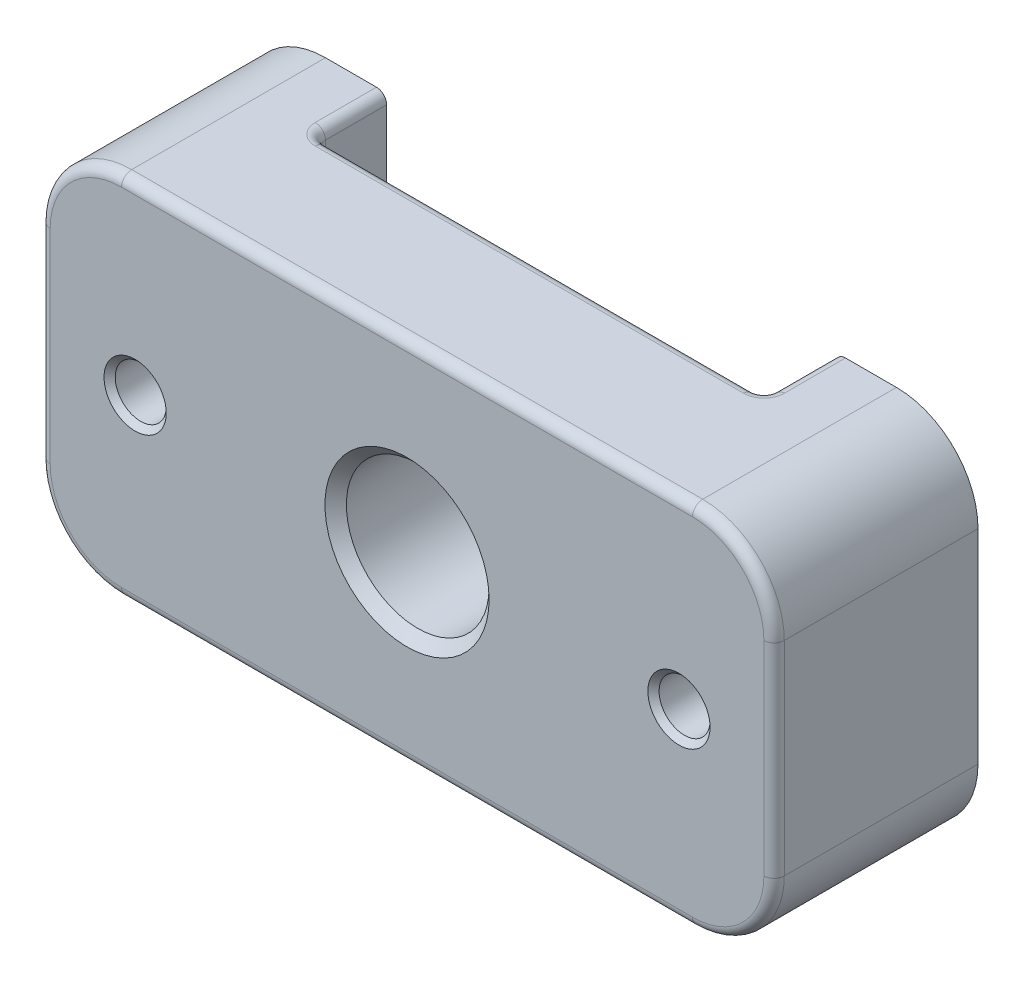
ISO-10303-21;
HEADER;
FILE_DESCRIPTION(('STEP AP214'),'2;1');
FILE_NAME('part.step','',(''),(''),'','','');
FILE_SCHEMA(('AUTOMOTIVE_DESIGN { 1 0 10303 214 1 1 1 1 }'));
ENDSEC;
DATA;
#1=APPLICATION_CONTEXT('core data for automotive mechanical design processes');
#2=APPLICATION_PROTOCOL_DEFINITION('international standard','automotive_design',2000,#1);
#3=PRODUCT_CONTEXT('',#1,'mechanical');
#4=PRODUCT('Part','Part','',(#3));
#5=PRODUCT_RELATED_PRODUCT_CATEGORY('part','',(#4));
#6=PRODUCT_DEFINITION_FORMATION('','',#4);
#7=PRODUCT_DEFINITION_CONTEXT('part definition',#1,'design');
#8=PRODUCT_DEFINITION('design','',#6,#7);
#9=PRODUCT_DEFINITION_SHAPE('','',#8);
#10=(LENGTH_UNIT() NAMED_UNIT(*) SI_UNIT(.MILLI.,.METRE.));
#11=(NAMED_UNIT(*) PLANE_ANGLE_UNIT() SI_UNIT($,.RADIAN.));
#12=(NAMED_UNIT(*) SI_UNIT($,.STERADIAN.) SOLID_ANGLE_UNIT());
#13=UNCERTAINTY_MEASURE_WITH_UNIT(LENGTH_MEASURE(1.E-05),#10,'distance_accuracy_value','');
#14=(GEOMETRIC_REPRESENTATION_CONTEXT(3) GLOBAL_UNCERTAINTY_ASSIGNED_CONTEXT((#13)) GLOBAL_UNIT_ASSIGNED_CONTEXT((#10,
#11,#12)) REPRESENTATION_CONTEXT('',''));
#15=CARTESIAN_POINT('',(0.,0.,0.));
#16=DIRECTION('',(0.,0.,1.));
#17=DIRECTION('',(1.,0.,0.));
#18=AXIS2_PLACEMENT_3D('',#15,#16,#17);
#19=CARTESIAN_POINT('',(14.,5.14174012529742,0.));
#20=DIRECTION('',(0.,0.,-1.));
#21=DIRECTION('',(-1.,0.,0.));
#22=AXIS2_PLACEMENT_3D('',#19,#20,#21);
#23=PLANE('',#22);
#24=DIRECTION('',(1.,0.,0.));
#25=VECTOR('',#24,1.);
#26=CARTESIAN_POINT('',(-14.,-8.85825987470258,0.));
#27=LINE('',#26,#25);
#28=CARTESIAN_POINT('',(11.5,-8.85825987470258,0.));
#29=VERTEX_POINT('',#28);
#30=CARTESIAN_POINT('',(14.,-8.85825987470258,0.));
#31=VERTEX_POINT('',#30);
#32=EDGE_CURVE('E275',#29,#31,#27,.T.);
#33=ORIENTED_EDGE('',*,*,#32,.F.);
#34=CARTESIAN_POINT('',(11.5,-8.35825987470258,0.));
#35=DIRECTION('',(0.,0.,-1.));
#36=DIRECTION('',(-1.,0.,0.));
#37=AXIS2_PLACEMENT_3D('',#34,#35,#36);
#38=CIRCLE('',#37,0.5);
#39=CARTESIAN_POINT('',(11.,-8.35825987470258,0.));
#40=VERTEX_POINT('',#39);
#41=EDGE_CURVE('E12',#29,#40,#38,.T.);
#42=ORIENTED_EDGE('',*,*,#41,.T.);
#43=DIRECTION('',(0.,-1.,0.));
#44=VECTOR('',#43,1.);
#45=CARTESIAN_POINT('',(11.,5.14174012529742,0.));
#46=LINE('',#45,#44);
#47=CARTESIAN_POINT('',(11.,8.64174012529742,0.));
#48=VERTEX_POINT('',#47);
#49=EDGE_CURVE('E310',#48,#40,#46,.T.);
#50=ORIENTED_EDGE('',*,*,#49,.F.);
#51=CARTESIAN_POINT('',(11.5,8.64174012529742,0.));
#52=DIRECTION('',(0.,0.,-1.));
#53=DIRECTION('',(-1.,0.,0.));
#54=AXIS2_PLACEMENT_3D('',#51,#52,#53);
#55=CIRCLE('',#54,0.5);
#56=CARTESIAN_POINT('',(11.5,9.14174012529742,0.));
#57=VERTEX_POINT('',#56);
#58=EDGE_CURVE('E69',#48,#57,#55,.T.);
#59=ORIENTED_EDGE('',*,*,#58,.T.);
#60=DIRECTION('',(-1.,0.,0.));
#61=VECTOR('',#60,1.);
#62=CARTESIAN_POINT('',(-14.,9.14174012529742,0.));
#63=LINE('',#62,#61);
#64=CARTESIAN_POINT('',(14.,9.14174012529742,0.));
#65=VERTEX_POINT('',#64);
#66=EDGE_CURVE('E224',#65,#57,#63,.T.);
#67=ORIENTED_EDGE('',*,*,#66,.F.);
#68=CARTESIAN_POINT('',(14.,5.14174012529742,0.));
#69=DIRECTION('',(0.,0.,1.));
#70=DIRECTION('',(-1.,0.,0.));
#71=AXIS2_PLACEMENT_3D('',#68,#69,#70);
#72=CIRCLE('',#71,4.);
#73=CARTESIAN_POINT('',(18.,5.14174012529742,0.));
#74=VERTEX_POINT('',#73);
#75=EDGE_CURVE('E240',#74,#65,#72,.T.);
#76=ORIENTED_EDGE('',*,*,#75,.F.);
#77=DIRECTION('',(0.,1.,0.));
#78=VECTOR('',#77,1.);
#79=CARTESIAN_POINT('',(18.,5.14174012529742,0.));
#80=LINE('',#79,#78);
#81=CARTESIAN_POINT('',(18.,-4.85825987470258,0.));
#82=VERTEX_POINT('',#81);
#83=EDGE_CURVE('E284',#82,#74,#80,.T.);
#84=ORIENTED_EDGE('',*,*,#83,.F.);
#85=CARTESIAN_POINT('',(14.,-4.85825987470258,0.));
#86=DIRECTION('',(0.,0.,1.));
#87=DIRECTION('',(1.,0.,0.));
#88=AXIS2_PLACEMENT_3D('',#85,#86,#87);
#89=CIRCLE('',#88,4.);
#90=EDGE_CURVE('E280',#31,#82,#89,.T.);
#91=ORIENTED_EDGE('',*,*,#90,.F.);
#92=EDGE_LOOP('',(#33,#42,#50,#59,#67,#76,#84,#91));
#93=FACE_BOUND('',#92,.T.);
#94=CARTESIAN_POINT('',(13.335,0.141740125297421,0.));
#95=DIRECTION('',(0.,0.,1.));
#96=DIRECTION('',(1.,0.,0.));
#97=AXIS2_PLACEMENT_3D('',#94,#95,#96);
#98=CIRCLE('',#97,1.25);
#99=CARTESIAN_POINT('',(14.585,0.141740125297421,0.));
#100=VERTEX_POINT('',#99);
#101=EDGE_CURVE('E261',#100,#100,#98,.T.);
#102=ORIENTED_EDGE('',*,*,#101,.T.);
#103=EDGE_LOOP('',(#102));
#104=FACE_BOUND('',#103,.T.);
#105=ADVANCED_FACE('F59',(#93,#104),#23,.T.);
#106=CARTESIAN_POINT('',(14.,5.14174012529742,10.));
#107=DIRECTION('',(0.,0.,-1.));
#108=DIRECTION('',(-1.,0.,0.));
#109=AXIS2_PLACEMENT_3D('',#106,#107,#108);
#110=PLANE('',#109);
#111=CARTESIAN_POINT('',(0.,0.141740125297421,10.));
#112=DIRECTION('',(0.,0.,1.));
#113=DIRECTION('',(1.,0.,0.));
#114=AXIS2_PLACEMENT_3D('',#111,#112,#113);
#115=CIRCLE('',#114,4.025);
#116=CARTESIAN_POINT('',(4.025,0.141740125297421,10.));
#117=VERTEX_POINT('',#116);
#118=EDGE_CURVE('E1012',#117,#117,#115,.T.);
#119=ORIENTED_EDGE('',*,*,#118,.F.);
#120=EDGE_LOOP('',(#119));
#121=FACE_BOUND('',#120,.T.);
#122=CARTESIAN_POINT('',(-13.335,0.141740125297421,10.));
#123=DIRECTION('',(0.,0.,1.));
#124=DIRECTION('',(1.,0.,0.));
#125=AXIS2_PLACEMENT_3D('',#122,#123,#124);
#126=CIRCLE('',#125,1.525);
#127=CARTESIAN_POINT('',(-11.81,0.141740125297421,10.));
#128=VERTEX_POINT('',#127);
#129=EDGE_CURVE('E660',#128,#128,#126,.T.);
#130=ORIENTED_EDGE('',*,*,#129,.F.);
#131=EDGE_LOOP('',(#130));
#132=FACE_BOUND('',#131,.T.);
#133=DIRECTION('',(0.,1.,0.));
#134=VECTOR('',#133,1.);
#135=CARTESIAN_POINT('',(17.5,5.14174012529742,10.));
#136=LINE('',#135,#134);
#137=CARTESIAN_POINT('',(17.5,-4.85825987470258,10.));
#138=VERTEX_POINT('',#137);
#139=CARTESIAN_POINT('',(17.5,5.14174012529742,10.));
#140=VERTEX_POINT('',#139);
#141=EDGE_CURVE('E332',#138,#140,#136,.T.);
#142=ORIENTED_EDGE('',*,*,#141,.T.);
#143=CARTESIAN_POINT('',(14.,5.14174012529742,10.));
#144=DIRECTION('',(0.,0.,-1.));
#145=DIRECTION('',(-1.,0.,0.));
#146=AXIS2_PLACEMENT_3D('',#143,#144,#145);
#147=CIRCLE('',#146,3.5);
#148=CARTESIAN_POINT('',(14.,8.64174012529742,10.));
#149=VERTEX_POINT('',#148);
#150=EDGE_CURVE('E335',#140,#149,#147,.F.);
#151=ORIENTED_EDGE('',*,*,#150,.T.);
#152=DIRECTION('',(-1.,0.,0.));
#153=VECTOR('',#152,1.);
#154=CARTESIAN_POINT('',(14.,8.64174012529742,10.));
#155=LINE('',#154,#153);
#156=CARTESIAN_POINT('',(-14.,8.64174012529742,10.));
#157=VERTEX_POINT('',#156);
#158=EDGE_CURVE('E314',#149,#157,#155,.T.);
#159=ORIENTED_EDGE('',*,*,#158,.T.);
#160=CARTESIAN_POINT('',(-14.,5.14174012529742,10.));
#161=DIRECTION('',(0.,0.,-1.));
#162=DIRECTION('',(-1.,0.,0.));
#163=AXIS2_PLACEMENT_3D('',#160,#161,#162);
#164=CIRCLE('',#163,3.5);
#165=CARTESIAN_POINT('',(-17.5,5.14174012529742,10.));
#166=VERTEX_POINT('',#165);
#167=EDGE_CURVE('E317',#157,#166,#164,.F.);
#168=ORIENTED_EDGE('',*,*,#167,.T.);
#169=DIRECTION('',(0.,-1.,0.));
#170=VECTOR('',#169,1.);
#171=CARTESIAN_POINT('',(-17.5,5.14174012529741,10.));
#172=LINE('',#171,#170);
#173=CARTESIAN_POINT('',(-17.5,-4.85825987470258,10.));
#174=VERTEX_POINT('',#173);
#175=EDGE_CURVE('E320',#166,#174,#172,.T.);
#176=ORIENTED_EDGE('',*,*,#175,.T.);
#177=CARTESIAN_POINT('',(-14.,-4.85825987470258,10.));
#178=DIRECTION('',(0.,0.,-1.));
#179=DIRECTION('',(-1.,0.,0.));
#180=AXIS2_PLACEMENT_3D('',#177,#178,#179);
#181=CIRCLE('',#180,3.5);
#182=CARTESIAN_POINT('',(-14.,-8.35825987470258,10.));
#183=VERTEX_POINT('',#182);
#184=EDGE_CURVE('E323',#174,#183,#181,.F.);
#185=ORIENTED_EDGE('',*,*,#184,.T.);
#186=DIRECTION('',(1.,0.,0.));
#187=VECTOR('',#186,1.);
#188=CARTESIAN_POINT('',(14.,-8.35825987470258,10.));
#189=LINE('',#188,#187);
#190=CARTESIAN_POINT('',(14.,-8.35825987470258,10.));
#191=VERTEX_POINT('',#190);
#192=EDGE_CURVE('E326',#183,#191,#189,.T.);
#193=ORIENTED_EDGE('',*,*,#192,.T.);
#194=CARTESIAN_POINT('',(14.,-4.85825987470258,10.));
#195=DIRECTION('',(0.,0.,-1.));
#196=DIRECTION('',(-1.,0.,0.));
#197=AXIS2_PLACEMENT_3D('',#194,#195,#196);
#198=CIRCLE('',#197,3.5);
#199=EDGE_CURVE('E329',#191,#138,#198,.F.);
#200=ORIENTED_EDGE('',*,*,#199,.T.);
#201=EDGE_LOOP('',(#142,#151,#159,#168,#176,#185,#193,#200));
#202=FACE_BOUND('',#201,.T.);
#203=CARTESIAN_POINT('',(13.335,0.141740125297421,10.));
#204=DIRECTION('',(0.,0.,1.));
#205=DIRECTION('',(1.,0.,0.));
#206=AXIS2_PLACEMENT_3D('',#203,#204,#205);
#207=CIRCLE('',#206,1.525);
#208=CARTESIAN_POINT('',(14.86,0.141740125297421,10.));
#209=VERTEX_POINT('',#208);
#210=EDGE_CURVE('E651',#209,#209,#207,.T.);
#211=ORIENTED_EDGE('',*,*,#210,.F.);
#212=EDGE_LOOP('',(#211));
#213=FACE_BOUND('',#212,.T.);
#214=ADVANCED_FACE('F533',(#121,#132,#202,#213),#110,.F.);
#215=CARTESIAN_POINT('',(14.,5.14174012529742,10.));
#216=DIRECTION('',(0.,0.,-1.));
#217=DIRECTION('',(-1.,0.,0.));
#218=AXIS2_PLACEMENT_3D('',#215,#216,#217);
#219=CYLINDRICAL_SURFACE('',#218,4.);
#220=DIRECTION('',(0.,0.,-1.));
#221=VECTOR('',#220,1.);
#222=CARTESIAN_POINT('',(14.,9.14174012529742,10.));
#223=LINE('',#222,#221);
#224=CARTESIAN_POINT('',(14.,9.14174012529742,9.5));
#225=VERTEX_POINT('',#224);
#226=EDGE_CURVE('E220',#225,#65,#223,.T.);
#227=ORIENTED_EDGE('',*,*,#226,.F.);
#228=CARTESIAN_POINT('',(14.,5.14174012529742,9.5));
#229=DIRECTION('',(0.,0.,-1.));
#230=DIRECTION('',(-1.,0.,0.));
#231=AXIS2_PLACEMENT_3D('',#228,#229,#230);
#232=CIRCLE('',#231,4.);
#233=CARTESIAN_POINT('',(18.,5.14174012529742,9.5));
#234=VERTEX_POINT('',#233);
#235=EDGE_CURVE('E339',#225,#234,#232,.T.);
#236=ORIENTED_EDGE('',*,*,#235,.T.);
#237=DIRECTION('',(0.,0.,-1.));
#238=VECTOR('',#237,1.);
#239=CARTESIAN_POINT('',(18.,5.14174012529742,10.));
#240=LINE('',#239,#238);
#241=EDGE_CURVE('E249',#234,#74,#240,.T.);
#242=ORIENTED_EDGE('',*,*,#241,.T.);
#243=ORIENTED_EDGE('',*,*,#75,.T.);
#244=EDGE_LOOP('',(#227,#236,#242,#243));
#245=FACE_BOUND('',#244,.T.);
#246=ADVANCED_FACE('F247',(#245),#219,.T.);
#247=CARTESIAN_POINT('',(-14.,9.14174012529742,10.));
#248=DIRECTION('',(0.,-1.,0.));
#249=DIRECTION('',(0.,0.,-1.));
#250=AXIS2_PLACEMENT_3D('',#247,#248,#249);
#251=PLANE('',#250);
#252=DIRECTION('',(0.,0.,-1.));
#253=VECTOR('',#252,1.);
#254=CARTESIAN_POINT('',(-14.,9.14174012529742,10.));
#255=LINE('',#254,#253);
#256=CARTESIAN_POINT('',(-14.,9.14174012529742,9.5));
#257=VERTEX_POINT('',#256);
#258=CARTESIAN_POINT('',(-14.,9.14174012529742,0.));
#259=VERTEX_POINT('',#258);
#260=EDGE_CURVE('E233',#257,#259,#255,.T.);
#261=ORIENTED_EDGE('',*,*,#260,.F.);
#262=DIRECTION('',(-1.,0.,0.));
#263=VECTOR('',#262,1.);
#264=CARTESIAN_POINT('',(-14.,9.14174012529742,9.5));
#265=LINE('',#264,#263);
#266=EDGE_CURVE('E226',#257,#225,#265,.F.);
#267=ORIENTED_EDGE('',*,*,#266,.T.);
#268=ORIENTED_EDGE('',*,*,#226,.T.);
#269=ORIENTED_EDGE('',*,*,#66,.T.);
#270=DIRECTION('',(0.,0.,-1.));
#271=VECTOR('',#270,1.);
#272=CARTESIAN_POINT('',(11.5,9.14174012529742,10.));
#273=LINE('',#272,#271);
#274=CARTESIAN_POINT('',(11.5,9.14174012529742,3.));
#275=VERTEX_POINT('',#274);
#276=EDGE_CURVE('E77',#57,#275,#273,.F.);
#277=ORIENTED_EDGE('',*,*,#276,.T.);
#278=CARTESIAN_POINT('',(10.5,9.14174012529742,3.));
#279=DIRECTION('',(0.,-1.,0.));
#280=DIRECTION('',(0.,0.,-1.));
#281=AXIS2_PLACEMENT_3D('',#278,#279,#280);
#282=CIRCLE('',#281,1.);
#283=CARTESIAN_POINT('',(10.5,9.14174012529742,4.));
#284=VERTEX_POINT('',#283);
#285=EDGE_CURVE('E82',#284,#275,#282,.F.);
#286=ORIENTED_EDGE('',*,*,#285,.F.);
#287=DIRECTION('',(1.,0.,0.));
#288=VECTOR('',#287,1.);
#289=CARTESIAN_POINT('',(-14.,9.14174012529742,4.));
#290=LINE('',#289,#288);
#291=CARTESIAN_POINT('',(-10.5,9.14174012529742,4.));
#292=VERTEX_POINT('',#291);
#293=EDGE_CURVE('E413',#284,#292,#290,.F.);
#294=ORIENTED_EDGE('',*,*,#293,.T.);
#295=CARTESIAN_POINT('',(-10.5,9.14174012529742,3.));
#296=DIRECTION('',(0.,-1.,0.));
#297=DIRECTION('',(0.,0.,-1.));
#298=AXIS2_PLACEMENT_3D('',#295,#296,#297);
#299=CIRCLE('',#298,1.);
#300=CARTESIAN_POINT('',(-11.5,9.14174012529742,3.));
#301=VERTEX_POINT('',#300);
#302=EDGE_CURVE('E409',#301,#292,#299,.F.);
#303=ORIENTED_EDGE('',*,*,#302,.F.);
#304=DIRECTION('',(0.,0.,1.));
#305=VECTOR('',#304,1.);
#306=CARTESIAN_POINT('',(-11.5,9.14174012529742,10.));
#307=LINE('',#306,#305);
#308=CARTESIAN_POINT('',(-11.5,9.14174012529742,0.));
#309=VERTEX_POINT('',#308);
#310=EDGE_CURVE('E406',#301,#309,#307,.F.);
#311=ORIENTED_EDGE('',*,*,#310,.T.);
#312=EDGE_CURVE('E245',#309,#259,#63,.T.);
#313=ORIENTED_EDGE('',*,*,#312,.T.);
#314=EDGE_LOOP('',(#261,#267,#268,#269,#277,#286,#294,#303,#311,#313));
#315=FACE_BOUND('',#314,.T.);
#316=ADVANCED_FACE('F223',(#315),#251,.F.);
#317=CARTESIAN_POINT('',(-14.,5.14174012529742,10.));
#318=DIRECTION('',(0.,0.,-1.));
#319=DIRECTION('',(-1.,0.,0.));
#320=AXIS2_PLACEMENT_3D('',#317,#318,#319);
#321=CYLINDRICAL_SURFACE('',#320,4.);
#322=DIRECTION('',(0.,0.,-1.));
#323=VECTOR('',#322,1.);
#324=CARTESIAN_POINT('',(-18.,5.14174012529742,10.));
#325=LINE('',#324,#323);
#326=CARTESIAN_POINT('',(-18.,5.14174012529742,9.5));
#327=VERTEX_POINT('',#326);
#328=CARTESIAN_POINT('',(-18.,5.14174012529742,0.));
#329=VERTEX_POINT('',#328);
#330=EDGE_CURVE('E302',#327,#329,#325,.T.);
#331=ORIENTED_EDGE('',*,*,#330,.F.);
#332=CARTESIAN_POINT('',(-14.,5.14174012529742,9.5));
#333=DIRECTION('',(0.,0.,-1.));
#334=DIRECTION('',(-1.,0.,0.));
#335=AXIS2_PLACEMENT_3D('',#332,#333,#334);
#336=CIRCLE('',#335,4.);
#337=EDGE_CURVE('E422',#327,#257,#336,.T.);
#338=ORIENTED_EDGE('',*,*,#337,.T.);
#339=ORIENTED_EDGE('',*,*,#260,.T.);
#340=CARTESIAN_POINT('',(-14.,5.14174012529742,0.));
#341=DIRECTION('',(0.,0.,1.));
#342=DIRECTION('',(1.,0.,0.));
#343=AXIS2_PLACEMENT_3D('',#340,#341,#342);
#344=CIRCLE('',#343,4.);
#345=EDGE_CURVE('E244',#259,#329,#344,.T.);
#346=ORIENTED_EDGE('',*,*,#345,.T.);
#347=EDGE_LOOP('',(#331,#338,#339,#346));
#348=FACE_BOUND('',#347,.T.);
#349=ADVANCED_FACE('F732',(#348),#321,.T.);
#350=CARTESIAN_POINT('',(-18.,5.14174012529742,10.));
#351=DIRECTION('',(1.,0.,0.));
#352=DIRECTION('',(0.,1.,0.));
#353=AXIS2_PLACEMENT_3D('',#350,#351,#352);
#354=PLANE('',#353);
#355=DIRECTION('',(0.,0.,-1.));
#356=VECTOR('',#355,1.);
#357=CARTESIAN_POINT('',(-18.,-4.85825987470258,10.));
#358=LINE('',#357,#356);
#359=CARTESIAN_POINT('',(-18.,-4.85825987470258,9.5));
#360=VERTEX_POINT('',#359);
#361=CARTESIAN_POINT('',(-18.,-4.85825987470258,0.));
#362=VERTEX_POINT('',#361);
#363=EDGE_CURVE('E299',#360,#362,#358,.T.);
#364=ORIENTED_EDGE('',*,*,#363,.F.);
#365=DIRECTION('',(0.,-1.,0.));
#366=VECTOR('',#365,1.);
#367=CARTESIAN_POINT('',(-18.,5.14174012529742,9.5));
#368=LINE('',#367,#366);
#369=EDGE_CURVE('E371',#360,#327,#368,.F.);
#370=ORIENTED_EDGE('',*,*,#369,.T.);
#371=ORIENTED_EDGE('',*,*,#330,.T.);
#372=DIRECTION('',(0.,-1.,0.));
#373=VECTOR('',#372,1.);
#374=CARTESIAN_POINT('',(-18.,5.14174012529742,0.));
#375=LINE('',#374,#373);
#376=EDGE_CURVE('E267',#329,#362,#375,.T.);
#377=ORIENTED_EDGE('',*,*,#376,.T.);
#378=EDGE_LOOP('',(#364,#370,#371,#377));
#379=FACE_BOUND('',#378,.T.);
#380=ADVANCED_FACE('F547',(#379),#354,.F.);
#381=CARTESIAN_POINT('',(-14.,-4.85825987470258,10.));
#382=DIRECTION('',(0.,0.,-1.));
#383=DIRECTION('',(-1.,0.,0.));
#384=AXIS2_PLACEMENT_3D('',#381,#382,#383);
#385=CYLINDRICAL_SURFACE('',#384,4.);
#386=DIRECTION('',(0.,0.,-1.));
#387=VECTOR('',#386,1.);
#388=CARTESIAN_POINT('',(-14.,-8.85825987470258,10.));
#389=LINE('',#388,#387);
#390=CARTESIAN_POINT('',(-14.,-8.85825987470258,9.5));
#391=VERTEX_POINT('',#390);
#392=CARTESIAN_POINT('',(-14.,-8.85825987470258,0.));
#393=VERTEX_POINT('',#392);
#394=EDGE_CURVE('E296',#391,#393,#389,.T.);
#395=ORIENTED_EDGE('',*,*,#394,.F.);
#396=CARTESIAN_POINT('',(-14.,-4.85825987470258,9.5));
#397=DIRECTION('',(0.,0.,-1.));
#398=DIRECTION('',(-1.,0.,0.));
#399=AXIS2_PLACEMENT_3D('',#396,#397,#398);
#400=CIRCLE('',#399,4.);
#401=EDGE_CURVE('E368',#391,#360,#400,.T.);
#402=ORIENTED_EDGE('',*,*,#401,.T.);
#403=ORIENTED_EDGE('',*,*,#363,.T.);
#404=CARTESIAN_POINT('',(-14.,-4.85825987470258,0.));
#405=DIRECTION('',(0.,0.,1.));
#406=DIRECTION('',(1.,0.,0.));
#407=AXIS2_PLACEMENT_3D('',#404,#405,#406);
#408=CIRCLE('',#407,4.);
#409=EDGE_CURVE('E271',#362,#393,#408,.T.);
#410=ORIENTED_EDGE('',*,*,#409,.T.);
#411=EDGE_LOOP('',(#395,#402,#403,#410));
#412=FACE_BOUND('',#411,.T.);
#413=ADVANCED_FACE('F545',(#412),#385,.T.);
#414=CARTESIAN_POINT('',(-14.,-8.85825987470258,10.));
#415=DIRECTION('',(0.,1.,0.));
#416=DIRECTION('',(-1.,0.,0.));
#417=AXIS2_PLACEMENT_3D('',#414,#415,#416);
#418=PLANE('',#417);
#419=DIRECTION('',(0.,0.,-1.));
#420=VECTOR('',#419,1.);
#421=CARTESIAN_POINT('',(14.,-8.85825987470258,10.));
#422=LINE('',#421,#420);
#423=CARTESIAN_POINT('',(14.,-8.85825987470258,9.5));
#424=VERTEX_POINT('',#423);
#425=EDGE_CURVE('E292',#424,#31,#422,.T.);
#426=ORIENTED_EDGE('',*,*,#425,.F.);
#427=DIRECTION('',(1.,0.,0.));
#428=VECTOR('',#427,1.);
#429=CARTESIAN_POINT('',(-14.,-8.85825987470258,9.5));
#430=LINE('',#429,#428);
#431=EDGE_CURVE('E365',#424,#391,#430,.F.);
#432=ORIENTED_EDGE('',*,*,#431,.T.);
#433=ORIENTED_EDGE('',*,*,#394,.T.);
#434=CARTESIAN_POINT('',(-11.5,-8.85825987470258,0.));
#435=VERTEX_POINT('',#434);
#436=EDGE_CURVE('E276',#393,#435,#27,.T.);
#437=ORIENTED_EDGE('',*,*,#436,.T.);
#438=DIRECTION('',(0.,0.,1.));
#439=VECTOR('',#438,1.);
#440=CARTESIAN_POINT('',(-11.5,-8.85825987470258,10.));
#441=LINE('',#440,#439);
#442=CARTESIAN_POINT('',(-11.5,-8.85825987470258,3.));
#443=VERTEX_POINT('',#442);
#444=EDGE_CURVE('E362',#435,#443,#441,.T.);
#445=ORIENTED_EDGE('',*,*,#444,.T.);
#446=CARTESIAN_POINT('',(-10.5,-8.85825987470258,3.));
#447=DIRECTION('',(0.,1.,0.));
#448=DIRECTION('',(-1.,0.,0.));
#449=AXIS2_PLACEMENT_3D('',#446,#447,#448);
#450=CIRCLE('',#449,1.);
#451=CARTESIAN_POINT('',(-10.5,-8.85825987470258,4.));
#452=VERTEX_POINT('',#451);
#453=EDGE_CURVE('E358',#452,#443,#450,.F.);
#454=ORIENTED_EDGE('',*,*,#453,.F.);
#455=DIRECTION('',(1.,0.,0.));
#456=VECTOR('',#455,1.);
#457=CARTESIAN_POINT('',(-14.,-8.85825987470258,4.));
#458=LINE('',#457,#456);
#459=CARTESIAN_POINT('',(10.5,-8.85825987470258,4.));
#460=VERTEX_POINT('',#459);
#461=EDGE_CURVE('E355',#452,#460,#458,.T.);
#462=ORIENTED_EDGE('',*,*,#461,.T.);
#463=CARTESIAN_POINT('',(10.5,-8.85825987470258,3.));
#464=DIRECTION('',(0.,1.,0.));
#465=DIRECTION('',(-1.,0.,0.));
#466=AXIS2_PLACEMENT_3D('',#463,#464,#465);
#467=CIRCLE('',#466,1.);
#468=CARTESIAN_POINT('',(11.5,-8.85825987470258,3.));
#469=VERTEX_POINT('',#468);
#470=EDGE_CURVE('E351',#469,#460,#467,.F.);
#471=ORIENTED_EDGE('',*,*,#470,.F.);
#472=DIRECTION('',(0.,0.,-1.));
#473=VECTOR('',#472,1.);
#474=CARTESIAN_POINT('',(11.5,-8.85825987470258,10.));
#475=LINE('',#474,#473);
#476=EDGE_CURVE('E348',#469,#29,#475,.T.);
#477=ORIENTED_EDGE('',*,*,#476,.T.);
#478=ORIENTED_EDGE('',*,*,#32,.T.);
#479=EDGE_LOOP('',(#426,#432,#433,#437,#445,#454,#462,#471,#477,#478));
#480=FACE_BOUND('',#479,.T.);
#481=ADVANCED_FACE('F513',(#480),#418,.F.);
#482=CARTESIAN_POINT('',(14.,-4.85825987470258,10.));
#483=DIRECTION('',(0.,0.,-1.));
#484=DIRECTION('',(-1.,0.,0.));
#485=AXIS2_PLACEMENT_3D('',#482,#483,#484);
#486=CYLINDRICAL_SURFACE('',#485,4.);
#487=DIRECTION('',(0.,0.,-1.));
#488=VECTOR('',#487,1.);
#489=CARTESIAN_POINT('',(18.,-4.85825987470258,10.));
#490=LINE('',#489,#488);
#491=CARTESIAN_POINT('',(18.,-4.85825987470258,9.5));
#492=VERTEX_POINT('',#491);
#493=EDGE_CURVE('E289',#492,#82,#490,.T.);
#494=ORIENTED_EDGE('',*,*,#493,.F.);
#495=CARTESIAN_POINT('',(14.,-4.85825987470258,9.5));
#496=DIRECTION('',(0.,0.,-1.));
#497=DIRECTION('',(-1.,0.,0.));
#498=AXIS2_PLACEMENT_3D('',#495,#496,#497);
#499=CIRCLE('',#498,4.);
#500=EDGE_CURVE('E345',#492,#424,#499,.T.);
#501=ORIENTED_EDGE('',*,*,#500,.T.);
#502=ORIENTED_EDGE('',*,*,#425,.T.);
#503=ORIENTED_EDGE('',*,*,#90,.T.);
#504=EDGE_LOOP('',(#494,#501,#502,#503));
#505=FACE_BOUND('',#504,.T.);
#506=ADVANCED_FACE('F518',(#505),#486,.T.);
#507=CARTESIAN_POINT('',(18.,5.14174012529742,10.));
#508=DIRECTION('',(-1.,0.,0.));
#509=DIRECTION('',(0.,0.,1.));
#510=AXIS2_PLACEMENT_3D('',#507,#508,#509);
#511=PLANE('',#510);
#512=ORIENTED_EDGE('',*,*,#241,.F.);
#513=DIRECTION('',(0.,1.,0.));
#514=VECTOR('',#513,1.);
#515=CARTESIAN_POINT('',(18.,5.14174012529742,9.5));
#516=LINE('',#515,#514);
#517=EDGE_CURVE('E342',#234,#492,#516,.F.);
#518=ORIENTED_EDGE('',*,*,#517,.T.);
#519=ORIENTED_EDGE('',*,*,#493,.T.);
#520=ORIENTED_EDGE('',*,*,#83,.T.);
#521=EDGE_LOOP('',(#512,#518,#519,#520));
#522=FACE_BOUND('',#521,.T.);
#523=ADVANCED_FACE('F620',(#522),#511,.F.);
#524=CARTESIAN_POINT('',(-13.335,0.141740125297421,0.));
#525=DIRECTION('',(0.,0.,1.));
#526=DIRECTION('',(1.,0.,0.));
#527=AXIS2_PLACEMENT_3D('',#524,#525,#526);
#528=CIRCLE('',#527,1.25);
#529=CARTESIAN_POINT('',(-12.085,0.141740125297421,0.));
#530=VERTEX_POINT('',#529);
#531=EDGE_CURVE('E648',#530,#530,#528,.T.);
#532=ORIENTED_EDGE('',*,*,#531,.T.);
#533=EDGE_LOOP('',(#532));
#534=FACE_BOUND('',#533,.T.);
#535=DIRECTION('',(0.,1.,0.));
#536=VECTOR('',#535,1.);
#537=CARTESIAN_POINT('',(-11.,5.14174012529742,0.));
#538=LINE('',#537,#536);
#539=CARTESIAN_POINT('',(-11.,-8.35825987470258,0.));
#540=VERTEX_POINT('',#539);
#541=CARTESIAN_POINT('',(-11.,8.64174012529742,0.));
#542=VERTEX_POINT('',#541);
#543=EDGE_CURVE('E232',#540,#542,#538,.T.);
#544=ORIENTED_EDGE('',*,*,#543,.F.);
#545=CARTESIAN_POINT('',(-11.5,-8.35825987470258,0.));
#546=DIRECTION('',(0.,0.,-1.));
#547=DIRECTION('',(-1.,0.,0.));
#548=AXIS2_PLACEMENT_3D('',#545,#546,#547);
#549=CIRCLE('',#548,0.5);
#550=EDGE_CURVE('E428',#540,#435,#549,.T.);
#551=ORIENTED_EDGE('',*,*,#550,.T.);
#552=ORIENTED_EDGE('',*,*,#436,.F.);
#553=ORIENTED_EDGE('',*,*,#409,.F.);
#554=ORIENTED_EDGE('',*,*,#376,.F.);
#555=ORIENTED_EDGE('',*,*,#345,.F.);
#556=ORIENTED_EDGE('',*,*,#312,.F.);
#557=CARTESIAN_POINT('',(-11.5,8.64174012529742,0.));
#558=DIRECTION('',(0.,0.,-1.));
#559=DIRECTION('',(-1.,0.,0.));
#560=AXIS2_PLACEMENT_3D('',#557,#558,#559);
#561=CIRCLE('',#560,0.5);
#562=EDGE_CURVE('E425',#309,#542,#561,.T.);
#563=ORIENTED_EDGE('',*,*,#562,.T.);
#564=EDGE_LOOP('',(#544,#551,#552,#553,#554,#555,#556,#563));
#565=FACE_BOUND('',#564,.T.);
#566=ADVANCED_FACE('F555',(#534,#565),#23,.T.);
#567=CARTESIAN_POINT('',(11.,-8.85825987470258,-3.5));
#568=DIRECTION('',(1.,0.,0.));
#569=DIRECTION('',(0.,0.,-1.));
#570=AXIS2_PLACEMENT_3D('',#567,#568,#569);
#571=PLANE('',#570);
#572=ORIENTED_EDGE('',*,*,#49,.T.);
#573=DIRECTION('',(0.,0.,-1.));
#574=VECTOR('',#573,1.);
#575=CARTESIAN_POINT('',(11.,-8.35825987470258,-3.5));
#576=LINE('',#575,#574);
#577=CARTESIAN_POINT('',(11.,-8.35825987470258,3.));
#578=VERTEX_POINT('',#577);
#579=EDGE_CURVE('E403',#40,#578,#576,.F.);
#580=ORIENTED_EDGE('',*,*,#579,.T.);
#581=DIRECTION('',(0.,1.,0.));
#582=VECTOR('',#581,1.);
#583=CARTESIAN_POINT('',(11.,9.14174012529742,3.));
#584=LINE('',#583,#582);
#585=CARTESIAN_POINT('',(11.,8.64174012529742,3.));
#586=VERTEX_POINT('',#585);
#587=EDGE_CURVE('E400',#578,#586,#584,.T.);
#588=ORIENTED_EDGE('',*,*,#587,.T.);
#589=DIRECTION('',(0.,0.,-1.));
#590=VECTOR('',#589,1.);
#591=CARTESIAN_POINT('',(11.,8.64174012529742,-3.5));
#592=LINE('',#591,#590);
#593=EDGE_CURVE('E397',#586,#48,#592,.T.);
#594=ORIENTED_EDGE('',*,*,#593,.T.);
#595=EDGE_LOOP('',(#572,#580,#588,#594));
#596=FACE_BOUND('',#595,.T.);
#597=ADVANCED_FACE('F581',(#596),#571,.F.);
#598=CARTESIAN_POINT('',(-11.,-8.85825987470258,3.5));
#599=DIRECTION('',(0.,0.,1.));
#600=DIRECTION('',(1.,0.,0.));
#601=AXIS2_PLACEMENT_3D('',#598,#599,#600);
#602=PLANE('',#601);
#603=CARTESIAN_POINT('',(0.,0.141740125297421,3.5));
#604=DIRECTION('',(0.,0.,1.));
#605=DIRECTION('',(1.,0.,0.));
#606=AXIS2_PLACEMENT_3D('',#603,#604,#605);
#607=CIRCLE('',#606,3.5);
#608=CARTESIAN_POINT('',(3.5,0.141740125297421,3.5));
#609=VERTEX_POINT('',#608);
#610=EDGE_CURVE('E63',#609,#609,#607,.T.);
#611=ORIENTED_EDGE('',*,*,#610,.T.);
#612=EDGE_LOOP('',(#611));
#613=FACE_BOUND('',#612,.T.);
#614=DIRECTION('',(1.,0.,0.));
#615=VECTOR('',#614,1.);
#616=CARTESIAN_POINT('',(-11.,-8.35825987470258,3.5));
#617=LINE('',#616,#615);
#618=CARTESIAN_POINT('',(10.5,-8.35825987470258,3.5));
#619=VERTEX_POINT('',#618);
#620=CARTESIAN_POINT('',(-10.5,-8.35825987470258,3.5));
#621=VERTEX_POINT('',#620);
#622=EDGE_CURVE('E380',#619,#621,#617,.F.);
#623=ORIENTED_EDGE('',*,*,#622,.T.);
#624=DIRECTION('',(0.,1.,0.));
#625=VECTOR('',#624,1.);
#626=CARTESIAN_POINT('',(-10.5,9.14174012529742,3.5));
#627=LINE('',#626,#625);
#628=CARTESIAN_POINT('',(-10.5,8.64174012529742,3.5));
#629=VERTEX_POINT('',#628);
#630=EDGE_CURVE('E383',#621,#629,#627,.T.);
#631=ORIENTED_EDGE('',*,*,#630,.T.);
#632=DIRECTION('',(1.,0.,0.));
#633=VECTOR('',#632,1.);
#634=CARTESIAN_POINT('',(-11.,8.64174012529742,3.5));
#635=LINE('',#634,#633);
#636=CARTESIAN_POINT('',(10.5,8.64174012529742,3.5));
#637=VERTEX_POINT('',#636);
#638=EDGE_CURVE('E374',#629,#637,#635,.T.);
#639=ORIENTED_EDGE('',*,*,#638,.T.);
#640=DIRECTION('',(0.,1.,0.));
#641=VECTOR('',#640,1.);
#642=CARTESIAN_POINT('',(10.5,-8.85825987470258,3.5));
#643=LINE('',#642,#641);
#644=EDGE_CURVE('E377',#637,#619,#643,.F.);
#645=ORIENTED_EDGE('',*,*,#644,.T.);
#646=EDGE_LOOP('',(#623,#631,#639,#645));
#647=FACE_BOUND('',#646,.T.);
#648=ADVANCED_FACE('F571',(#613,#647),#602,.F.);
#649=CARTESIAN_POINT('',(-11.,-8.85825987470258,-3.5));
#650=DIRECTION('',(-1.,0.,0.));
#651=DIRECTION('',(0.,0.,1.));
#652=AXIS2_PLACEMENT_3D('',#649,#650,#651);
#653=PLANE('',#652);
#654=DIRECTION('',(0.,1.,0.));
#655=VECTOR('',#654,1.);
#656=CARTESIAN_POINT('',(-11.,-8.85825987470258,3.));
#657=LINE('',#656,#655);
#658=CARTESIAN_POINT('',(-11.,8.64174012529742,3.));
#659=VERTEX_POINT('',#658);
#660=CARTESIAN_POINT('',(-11.,-8.35825987470258,3.));
#661=VERTEX_POINT('',#660);
#662=EDGE_CURVE('E390',#659,#661,#657,.F.);
#663=ORIENTED_EDGE('',*,*,#662,.T.);
#664=DIRECTION('',(0.,0.,1.));
#665=VECTOR('',#664,1.);
#666=CARTESIAN_POINT('',(-11.,-8.35825987470258,-3.5));
#667=LINE('',#666,#665);
#668=EDGE_CURVE('E394',#661,#540,#667,.F.);
#669=ORIENTED_EDGE('',*,*,#668,.T.);
#670=ORIENTED_EDGE('',*,*,#543,.T.);
#671=DIRECTION('',(0.,0.,1.));
#672=VECTOR('',#671,1.);
#673=CARTESIAN_POINT('',(-11.,8.64174012529742,-3.5));
#674=LINE('',#673,#672);
#675=EDGE_CURVE('E387',#542,#659,#674,.T.);
#676=ORIENTED_EDGE('',*,*,#675,.T.);
#677=EDGE_LOOP('',(#663,#669,#670,#676));
#678=FACE_BOUND('',#677,.T.);
#679=ADVANCED_FACE('F604',(#678),#653,.F.);
#680=CARTESIAN_POINT('',(-14.,-4.85825987470258,9.5));
#681=DIRECTION('',(0.,0.,-1.));
#682=DIRECTION('',(-1.,0.,0.));
#683=AXIS2_PLACEMENT_3D('',#680,#681,#682);
#684=TOROIDAL_SURFACE('',#683,3.5,0.5);
#685=CARTESIAN_POINT('',(-17.5,-4.85825987470258,9.5));
#686=DIRECTION('',(0.,1.,0.));
#687=DIRECTION('',(0.,0.,1.));
#688=AXIS2_PLACEMENT_3D('',#685,#686,#687);
#689=CIRCLE('',#688,0.5);
#690=EDGE_CURVE('E258',#360,#174,#689,.T.);
#691=ORIENTED_EDGE('',*,*,#690,.F.);
#692=ORIENTED_EDGE('',*,*,#401,.F.);
#693=CARTESIAN_POINT('',(-14.,-8.35825987470258,9.5));
#694=DIRECTION('',(1.,0.,0.));
#695=DIRECTION('',(0.,0.,-1.));
#696=AXIS2_PLACEMENT_3D('',#693,#694,#695);
#697=CIRCLE('',#696,0.5);
#698=EDGE_CURVE('E252',#183,#391,#697,.T.);
#699=ORIENTED_EDGE('',*,*,#698,.F.);
#700=ORIENTED_EDGE('',*,*,#184,.F.);
#701=EDGE_LOOP('',(#691,#692,#699,#700));
#702=FACE_BOUND('',#701,.T.);
#703=ADVANCED_FACE('F541',(#702),#684,.T.);
#704=CARTESIAN_POINT('',(14.,-8.35825987470258,9.5));
#705=DIRECTION('',(1.,0.,0.));
#706=DIRECTION('',(0.,1.,0.));
#707=AXIS2_PLACEMENT_3D('',#704,#705,#706);
#708=CYLINDRICAL_SURFACE('',#707,0.5);
#709=ORIENTED_EDGE('',*,*,#698,.T.);
#710=ORIENTED_EDGE('',*,*,#431,.F.);
#711=CARTESIAN_POINT('',(14.,-8.35825987470258,9.5));
#712=DIRECTION('',(1.,0.,0.));
#713=DIRECTION('',(0.,0.,-1.));
#714=AXIS2_PLACEMENT_3D('',#711,#712,#713);
#715=CIRCLE('',#714,0.5);
#716=EDGE_CURVE('E452',#191,#424,#715,.T.);
#717=ORIENTED_EDGE('',*,*,#716,.F.);
#718=ORIENTED_EDGE('',*,*,#192,.F.);
#719=EDGE_LOOP('',(#709,#710,#717,#718));
#720=FACE_BOUND('',#719,.T.);
#721=ADVANCED_FACE('F524',(#720),#708,.T.);
#722=CARTESIAN_POINT('',(-17.5,5.14174012529741,9.5));
#723=DIRECTION('',(0.,-1.,0.));
#724=DIRECTION('',(1.,0.,0.));
#725=AXIS2_PLACEMENT_3D('',#722,#723,#724);
#726=CYLINDRICAL_SURFACE('',#725,0.5);
#727=ORIENTED_EDGE('',*,*,#690,.T.);
#728=ORIENTED_EDGE('',*,*,#175,.F.);
#729=CARTESIAN_POINT('',(-17.5,5.14174012529742,9.5));
#730=DIRECTION('',(0.,1.,0.));
#731=DIRECTION('',(0.,0.,1.));
#732=AXIS2_PLACEMENT_3D('',#729,#730,#731);
#733=CIRCLE('',#732,0.5);
#734=EDGE_CURVE('E448',#327,#166,#733,.T.);
#735=ORIENTED_EDGE('',*,*,#734,.F.);
#736=ORIENTED_EDGE('',*,*,#369,.F.);
#737=EDGE_LOOP('',(#727,#728,#735,#736));
#738=FACE_BOUND('',#737,.T.);
#739=ADVANCED_FACE('F696',(#738),#726,.T.);
#740=CARTESIAN_POINT('',(14.,-4.85825987470258,9.5));
#741=DIRECTION('',(0.,0.,-1.));
#742=DIRECTION('',(-1.,0.,0.));
#743=AXIS2_PLACEMENT_3D('',#740,#741,#742);
#744=TOROIDAL_SURFACE('',#743,3.5,0.5);
#745=ORIENTED_EDGE('',*,*,#716,.T.);
#746=ORIENTED_EDGE('',*,*,#500,.F.);
#747=CARTESIAN_POINT('',(17.5,-4.85825987470258,9.5));
#748=DIRECTION('',(0.,1.,0.));
#749=DIRECTION('',(0.,0.,1.));
#750=AXIS2_PLACEMENT_3D('',#747,#748,#749);
#751=CIRCLE('',#750,0.5);
#752=EDGE_CURVE('E444',#138,#492,#751,.T.);
#753=ORIENTED_EDGE('',*,*,#752,.F.);
#754=ORIENTED_EDGE('',*,*,#199,.F.);
#755=EDGE_LOOP('',(#745,#746,#753,#754));
#756=FACE_BOUND('',#755,.T.);
#757=ADVANCED_FACE('F529',(#756),#744,.T.);
#758=CARTESIAN_POINT('',(-14.,5.14174012529742,9.5));
#759=DIRECTION('',(0.,0.,-1.));
#760=DIRECTION('',(-1.,0.,0.));
#761=AXIS2_PLACEMENT_3D('',#758,#759,#760);
#762=TOROIDAL_SURFACE('',#761,3.5,0.5);
#763=ORIENTED_EDGE('',*,*,#734,.T.);
#764=ORIENTED_EDGE('',*,*,#167,.F.);
#765=CARTESIAN_POINT('',(-14.,8.64174012529742,9.5));
#766=DIRECTION('',(1.,0.,0.));
#767=DIRECTION('',(0.,0.,-1.));
#768=AXIS2_PLACEMENT_3D('',#765,#766,#767);
#769=CIRCLE('',#768,0.5);
#770=EDGE_CURVE('E440',#257,#157,#769,.T.);
#771=ORIENTED_EDGE('',*,*,#770,.F.);
#772=ORIENTED_EDGE('',*,*,#337,.F.);
#773=EDGE_LOOP('',(#763,#764,#771,#772));
#774=FACE_BOUND('',#773,.T.);
#775=ADVANCED_FACE('F610',(#774),#762,.T.);
#776=CARTESIAN_POINT('',(17.5,5.14174012529742,9.5));
#777=DIRECTION('',(0.,1.,0.));
#778=DIRECTION('',(0.,0.,1.));
#779=AXIS2_PLACEMENT_3D('',#776,#777,#778);
#780=CYLINDRICAL_SURFACE('',#779,0.5);
#781=ORIENTED_EDGE('',*,*,#752,.T.);
#782=ORIENTED_EDGE('',*,*,#517,.F.);
#783=CARTESIAN_POINT('',(17.5,5.14174012529742,9.5));
#784=DIRECTION('',(0.,1.,0.));
#785=DIRECTION('',(0.,0.,1.));
#786=AXIS2_PLACEMENT_3D('',#783,#784,#785);
#787=CIRCLE('',#786,0.5);
#788=EDGE_CURVE('E436',#140,#234,#787,.T.);
#789=ORIENTED_EDGE('',*,*,#788,.F.);
#790=ORIENTED_EDGE('',*,*,#141,.F.);
#791=EDGE_LOOP('',(#781,#782,#789,#790));
#792=FACE_BOUND('',#791,.T.);
#793=ADVANCED_FACE('F622',(#792),#780,.T.);
#794=CARTESIAN_POINT('',(14.,8.64174012529742,9.5));
#795=DIRECTION('',(-1.,0.,0.));
#796=DIRECTION('',(0.,0.,1.));
#797=AXIS2_PLACEMENT_3D('',#794,#795,#796);
#798=CYLINDRICAL_SURFACE('',#797,0.5);
#799=ORIENTED_EDGE('',*,*,#770,.T.);
#800=ORIENTED_EDGE('',*,*,#158,.F.);
#801=CARTESIAN_POINT('',(14.,8.64174012529742,9.5));
#802=DIRECTION('',(1.,0.,0.));
#803=DIRECTION('',(0.,0.,-1.));
#804=AXIS2_PLACEMENT_3D('',#801,#802,#803);
#805=CIRCLE('',#804,0.5);
#806=EDGE_CURVE('E433',#225,#149,#805,.T.);
#807=ORIENTED_EDGE('',*,*,#806,.F.);
#808=ORIENTED_EDGE('',*,*,#266,.F.);
#809=EDGE_LOOP('',(#799,#800,#807,#808));
#810=FACE_BOUND('',#809,.T.);
#811=ADVANCED_FACE('F614',(#810),#798,.T.);
#812=CARTESIAN_POINT('',(14.,5.14174012529742,9.5));
#813=DIRECTION('',(0.,0.,-1.));
#814=DIRECTION('',(-1.,0.,0.));
#815=AXIS2_PLACEMENT_3D('',#812,#813,#814);
#816=TOROIDAL_SURFACE('',#815,3.5,0.5);
#817=ORIENTED_EDGE('',*,*,#788,.T.);
#818=ORIENTED_EDGE('',*,*,#235,.F.);
#819=ORIENTED_EDGE('',*,*,#806,.T.);
#820=ORIENTED_EDGE('',*,*,#150,.F.);
#821=EDGE_LOOP('',(#817,#818,#819,#820));
#822=FACE_BOUND('',#821,.T.);
#823=ADVANCED_FACE('F617',(#822),#816,.T.);
#824=CARTESIAN_POINT('',(11.5,-8.35825987470258,10.));
#825=DIRECTION('',(0.,0.,-1.));
#826=DIRECTION('',(-1.,0.,0.));
#827=AXIS2_PLACEMENT_3D('',#824,#825,#826);
#828=CYLINDRICAL_SURFACE('',#827,0.5);
#829=ORIENTED_EDGE('',*,*,#41,.F.);
#830=ORIENTED_EDGE('',*,*,#476,.F.);
#831=CARTESIAN_POINT('',(11.5,-8.35825987470258,3.));
#832=DIRECTION('',(0.,0.,1.));
#833=DIRECTION('',(1.,0.,0.));
#834=AXIS2_PLACEMENT_3D('',#831,#832,#833);
#835=CIRCLE('',#834,0.5);
#836=EDGE_CURVE('E437',#578,#469,#835,.T.);
#837=ORIENTED_EDGE('',*,*,#836,.F.);
#838=ORIENTED_EDGE('',*,*,#579,.F.);
#839=EDGE_LOOP('',(#829,#830,#837,#838));
#840=FACE_BOUND('',#839,.T.);
#841=ADVANCED_FACE('F61',(#840),#828,.T.);
#842=CARTESIAN_POINT('',(10.5,-8.85825987470258,3.));
#843=DIRECTION('',(0.,-1.,0.));
#844=DIRECTION('',(0.,0.,-1.));
#845=AXIS2_PLACEMENT_3D('',#842,#843,#844);
#846=CYLINDRICAL_SURFACE('',#845,0.5);
#847=CARTESIAN_POINT('',(10.5,8.64174012529742,3.));
#848=DIRECTION('',(0.,-1.,0.));
#849=DIRECTION('',(0.,0.,-1.));
#850=AXIS2_PLACEMENT_3D('',#847,#848,#849);
#851=CIRCLE('',#850,0.5);
#852=EDGE_CURVE('E493',#586,#637,#851,.T.);
#853=ORIENTED_EDGE('',*,*,#852,.F.);
#854=ORIENTED_EDGE('',*,*,#587,.F.);
#855=CARTESIAN_POINT('',(10.5,-8.35825987470258,3.));
#856=DIRECTION('',(0.,1.,0.));
#857=DIRECTION('',(-1.,0.,0.));
#858=AXIS2_PLACEMENT_3D('',#855,#856,#857);
#859=CIRCLE('',#858,0.5);
#860=EDGE_CURVE('E497',#619,#578,#859,.T.);
#861=ORIENTED_EDGE('',*,*,#860,.F.);
#862=ORIENTED_EDGE('',*,*,#644,.F.);
#863=EDGE_LOOP('',(#853,#854,#861,#862));
#864=FACE_BOUND('',#863,.T.);
#865=ADVANCED_FACE('F578',(#864),#846,.F.);
#866=CARTESIAN_POINT('',(11.5,8.64174012529742,-3.5));
#867=DIRECTION('',(0.,0.,-1.));
#868=DIRECTION('',(-1.,0.,0.));
#869=AXIS2_PLACEMENT_3D('',#866,#867,#868);
#870=CYLINDRICAL_SURFACE('',#869,0.5);
#871=ORIENTED_EDGE('',*,*,#58,.F.);
#872=ORIENTED_EDGE('',*,*,#593,.F.);
#873=CARTESIAN_POINT('',(11.5,8.64174012529742,3.));
#874=DIRECTION('',(0.,0.,1.));
#875=DIRECTION('',(1.,0.,0.));
#876=AXIS2_PLACEMENT_3D('',#873,#874,#875);
#877=CIRCLE('',#876,0.5);
#878=EDGE_CURVE('E489',#275,#586,#877,.T.);
#879=ORIENTED_EDGE('',*,*,#878,.F.);
#880=ORIENTED_EDGE('',*,*,#276,.F.);
#881=EDGE_LOOP('',(#871,#872,#879,#880));
#882=FACE_BOUND('',#881,.T.);
#883=ADVANCED_FACE('F583',(#882),#870,.T.);
#884=CARTESIAN_POINT('',(10.5,-8.35825987470258,3.));
#885=DIRECTION('',(0.,1.,0.));
#886=DIRECTION('',(-1.,0.,0.));
#887=AXIS2_PLACEMENT_3D('',#884,#885,#886);
#888=TOROIDAL_SURFACE('',#887,1.,0.5);
#889=ORIENTED_EDGE('',*,*,#836,.T.);
#890=ORIENTED_EDGE('',*,*,#470,.T.);
#891=CARTESIAN_POINT('',(10.5,-8.35825987470258,4.));
#892=DIRECTION('',(1.,0.,0.));
#893=DIRECTION('',(0.,0.,-1.));
#894=AXIS2_PLACEMENT_3D('',#891,#892,#893);
#895=CIRCLE('',#894,0.5);
#896=EDGE_CURVE('E485',#619,#460,#895,.F.);
#897=ORIENTED_EDGE('',*,*,#896,.F.);
#898=ORIENTED_EDGE('',*,*,#860,.T.);
#899=EDGE_LOOP('',(#889,#890,#897,#898));
#900=FACE_BOUND('',#899,.T.);
#901=ADVANCED_FACE('F504',(#900),#888,.T.);
#902=CARTESIAN_POINT('',(10.5,8.64174012529742,3.));
#903=DIRECTION('',(0.,-1.,0.));
#904=DIRECTION('',(0.,0.,-1.));
#905=AXIS2_PLACEMENT_3D('',#902,#903,#904);
#906=TOROIDAL_SURFACE('',#905,1.,0.5);
#907=ORIENTED_EDGE('',*,*,#878,.T.);
#908=ORIENTED_EDGE('',*,*,#852,.T.);
#909=CARTESIAN_POINT('',(10.5,8.64174012529742,4.));
#910=DIRECTION('',(1.,0.,0.));
#911=DIRECTION('',(0.,0.,-1.));
#912=AXIS2_PLACEMENT_3D('',#909,#910,#911);
#913=CIRCLE('',#912,0.5);
#914=EDGE_CURVE('E481',#284,#637,#913,.F.);
#915=ORIENTED_EDGE('',*,*,#914,.F.);
#916=ORIENTED_EDGE('',*,*,#285,.T.);
#917=EDGE_LOOP('',(#907,#908,#915,#916));
#918=FACE_BOUND('',#917,.T.);
#919=ADVANCED_FACE('F585',(#918),#906,.T.);
#920=CARTESIAN_POINT('',(-11.5,-8.35825987470258,10.));
#921=DIRECTION('',(0.,0.,1.));
#922=DIRECTION('',(1.,0.,0.));
#923=AXIS2_PLACEMENT_3D('',#920,#921,#922);
#924=CYLINDRICAL_SURFACE('',#923,0.5);
#925=ORIENTED_EDGE('',*,*,#550,.F.);
#926=ORIENTED_EDGE('',*,*,#668,.F.);
#927=CARTESIAN_POINT('',(-11.5,-8.35825987470258,3.));
#928=DIRECTION('',(0.,0.,1.));
#929=DIRECTION('',(1.,0.,0.));
#930=AXIS2_PLACEMENT_3D('',#927,#928,#929);
#931=CIRCLE('',#930,0.5);
#932=EDGE_CURVE('E477',#443,#661,#931,.T.);
#933=ORIENTED_EDGE('',*,*,#932,.F.);
#934=ORIENTED_EDGE('',*,*,#444,.F.);
#935=EDGE_LOOP('',(#925,#926,#933,#934));
#936=FACE_BOUND('',#935,.T.);
#937=ADVANCED_FACE('F560',(#936),#924,.T.);
#938=CARTESIAN_POINT('',(-14.,-8.35825987470258,4.));
#939=DIRECTION('',(1.,0.,0.));
#940=DIRECTION('',(0.,1.,0.));
#941=AXIS2_PLACEMENT_3D('',#938,#939,#940);
#942=CYLINDRICAL_SURFACE('',#941,0.5);
#943=ORIENTED_EDGE('',*,*,#896,.T.);
#944=ORIENTED_EDGE('',*,*,#461,.F.);
#945=CARTESIAN_POINT('',(-10.5,-8.35825987470258,4.));
#946=DIRECTION('',(-1.,0.,0.));
#947=DIRECTION('',(0.,0.,1.));
#948=AXIS2_PLACEMENT_3D('',#945,#946,#947);
#949=CIRCLE('',#948,0.5);
#950=EDGE_CURVE('E473',#621,#452,#949,.T.);
#951=ORIENTED_EDGE('',*,*,#950,.F.);
#952=ORIENTED_EDGE('',*,*,#622,.F.);
#953=EDGE_LOOP('',(#943,#944,#951,#952));
#954=FACE_BOUND('',#953,.T.);
#955=ADVANCED_FACE('F568',(#954),#942,.T.);
#956=CARTESIAN_POINT('',(-11.,8.64174012529742,4.));
#957=DIRECTION('',(1.,0.,0.));
#958=DIRECTION('',(0.,0.,-1.));
#959=AXIS2_PLACEMENT_3D('',#956,#957,#958);
#960=CYLINDRICAL_SURFACE('',#959,0.5);
#961=ORIENTED_EDGE('',*,*,#914,.T.);
#962=ORIENTED_EDGE('',*,*,#638,.F.);
#963=CARTESIAN_POINT('',(-10.5,8.64174012529742,4.));
#964=DIRECTION('',(-1.,0.,0.));
#965=DIRECTION('',(0.,0.,1.));
#966=AXIS2_PLACEMENT_3D('',#963,#964,#965);
#967=CIRCLE('',#966,0.5);
#968=EDGE_CURVE('E469',#292,#629,#967,.T.);
#969=ORIENTED_EDGE('',*,*,#968,.F.);
#970=ORIENTED_EDGE('',*,*,#293,.F.);
#971=EDGE_LOOP('',(#961,#962,#969,#970));
#972=FACE_BOUND('',#971,.T.);
#973=ADVANCED_FACE('F589',(#972),#960,.T.);
#974=CARTESIAN_POINT('',(-11.5,8.64174012529742,-3.5));
#975=DIRECTION('',(0.,0.,1.));
#976=DIRECTION('',(1.,0.,0.));
#977=AXIS2_PLACEMENT_3D('',#974,#975,#976);
#978=CYLINDRICAL_SURFACE('',#977,0.5);
#979=ORIENTED_EDGE('',*,*,#562,.F.);
#980=ORIENTED_EDGE('',*,*,#310,.F.);
#981=CARTESIAN_POINT('',(-11.5,8.64174012529742,3.));
#982=DIRECTION('',(0.,0.,1.));
#983=DIRECTION('',(1.,0.,0.));
#984=AXIS2_PLACEMENT_3D('',#981,#982,#983);
#985=CIRCLE('',#984,0.5);
#986=EDGE_CURVE('E465',#659,#301,#985,.T.);
#987=ORIENTED_EDGE('',*,*,#986,.F.);
#988=ORIENTED_EDGE('',*,*,#675,.F.);
#989=EDGE_LOOP('',(#979,#980,#987,#988));
#990=FACE_BOUND('',#989,.T.);
#991=ADVANCED_FACE('F596',(#990),#978,.T.);
#992=CARTESIAN_POINT('',(-10.5,-8.35825987470258,3.));
#993=DIRECTION('',(0.,1.,0.));
#994=DIRECTION('',(-1.,0.,0.));
#995=AXIS2_PLACEMENT_3D('',#992,#993,#994);
#996=TOROIDAL_SURFACE('',#995,1.,0.5);
#997=ORIENTED_EDGE('',*,*,#453,.T.);
#998=ORIENTED_EDGE('',*,*,#932,.T.);
#999=CARTESIAN_POINT('',(-10.5,-8.35825987470258,3.));
#1000=DIRECTION('',(0.,1.,0.));
#1001=DIRECTION('',(-1.,0.,0.));
#1002=AXIS2_PLACEMENT_3D('',#999,#1000,#1001);
#1003=CIRCLE('',#1002,0.5);
#1004=EDGE_CURVE('E462',#621,#661,#1003,.F.);
#1005=ORIENTED_EDGE('',*,*,#1004,.F.);
#1006=ORIENTED_EDGE('',*,*,#950,.T.);
#1007=EDGE_LOOP('',(#997,#998,#1005,#1006));
#1008=FACE_BOUND('',#1007,.T.);
#1009=ADVANCED_FACE('F564',(#1008),#996,.T.);
#1010=CARTESIAN_POINT('',(-10.5,8.64174012529742,3.));
#1011=DIRECTION('',(0.,-1.,0.));
#1012=DIRECTION('',(0.,0.,-1.));
#1013=AXIS2_PLACEMENT_3D('',#1010,#1011,#1012);
#1014=TOROIDAL_SURFACE('',#1013,1.,0.5);
#1015=ORIENTED_EDGE('',*,*,#302,.T.);
#1016=ORIENTED_EDGE('',*,*,#968,.T.);
#1017=CARTESIAN_POINT('',(-10.5,8.64174012529742,3.));
#1018=DIRECTION('',(0.,-1.,0.));
#1019=DIRECTION('',(0.,0.,-1.));
#1020=AXIS2_PLACEMENT_3D('',#1017,#1018,#1019);
#1021=CIRCLE('',#1020,0.5);
#1022=EDGE_CURVE('E459',#659,#629,#1021,.F.);
#1023=ORIENTED_EDGE('',*,*,#1022,.F.);
#1024=ORIENTED_EDGE('',*,*,#986,.T.);
#1025=EDGE_LOOP('',(#1015,#1016,#1023,#1024));
#1026=FACE_BOUND('',#1025,.T.);
#1027=ADVANCED_FACE('F600',(#1026),#1014,.T.);
#1028=CARTESIAN_POINT('',(-10.5,-8.85825987470258,3.));
#1029=DIRECTION('',(0.,-1.,0.));
#1030=DIRECTION('',(0.,0.,-1.));
#1031=AXIS2_PLACEMENT_3D('',#1028,#1029,#1030);
#1032=CYLINDRICAL_SURFACE('',#1031,0.5);
#1033=ORIENTED_EDGE('',*,*,#1004,.T.);
#1034=ORIENTED_EDGE('',*,*,#662,.F.);
#1035=ORIENTED_EDGE('',*,*,#1022,.T.);
#1036=ORIENTED_EDGE('',*,*,#630,.F.);
#1037=EDGE_LOOP('',(#1033,#1034,#1035,#1036));
#1038=FACE_BOUND('',#1037,.T.);
#1039=ADVANCED_FACE('F602',(#1038),#1032,.F.);
#1040=CARTESIAN_POINT('',(13.335,0.141740125297421,10.));
#1041=DIRECTION('',(0.,0.,1.));
#1042=DIRECTION('',(1.,0.,0.));
#1043=AXIS2_PLACEMENT_3D('',#1040,#1041,#1042);
#1044=CYLINDRICAL_SURFACE('',#1043,1.25);
#1045=ORIENTED_EDGE('',*,*,#101,.F.);
#1046=EDGE_LOOP('',(#1045));
#1047=FACE_BOUND('',#1046,.T.);
#1048=CARTESIAN_POINT('',(13.335,0.141740125297421,9.725));
#1049=DIRECTION('',(0.,0.,1.));
#1050=DIRECTION('',(1.,0.,0.));
#1051=AXIS2_PLACEMENT_3D('',#1048,#1049,#1050);
#1052=CIRCLE('',#1051,1.25);
#1053=CARTESIAN_POINT('',(14.585,0.141740125297421,9.725));
#1054=VERTEX_POINT('',#1053);
#1055=EDGE_CURVE('E657',#1054,#1054,#1052,.T.);
#1056=ORIENTED_EDGE('',*,*,#1055,.T.);
#1057=EDGE_LOOP('',(#1056));
#1058=FACE_BOUND('',#1057,.T.);
#1059=ADVANCED_FACE('F671',(#1047,#1058),#1044,.F.);
#1060=CARTESIAN_POINT('',(13.335,0.141740125297421,10.));
#1061=DIRECTION('',(0.,0.,1.));
#1062=DIRECTION('',(1.,0.,0.));
#1063=AXIS2_PLACEMENT_3D('',#1060,#1061,#1062);
#1064=CONICAL_SURFACE('',#1063,1.525,0.785398163397448);
#1065=ORIENTED_EDGE('',*,*,#1055,.F.);
#1066=EDGE_LOOP('',(#1065));
#1067=FACE_BOUND('',#1066,.T.);
#1068=ORIENTED_EDGE('',*,*,#210,.T.);
#1069=EDGE_LOOP('',(#1068));
#1070=FACE_BOUND('',#1069,.T.);
#1071=ADVANCED_FACE('F673',(#1067,#1070),#1064,.F.);
#1072=CARTESIAN_POINT('',(-13.335,0.141740125297421,10.));
#1073=DIRECTION('',(0.,0.,1.));
#1074=DIRECTION('',(1.,0.,0.));
#1075=AXIS2_PLACEMENT_3D('',#1072,#1073,#1074);
#1076=CYLINDRICAL_SURFACE('',#1075,1.25);
#1077=ORIENTED_EDGE('',*,*,#531,.F.);
#1078=EDGE_LOOP('',(#1077));
#1079=FACE_BOUND('',#1078,.T.);
#1080=CARTESIAN_POINT('',(-13.335,0.141740125297421,9.725));
#1081=DIRECTION('',(0.,0.,1.));
#1082=DIRECTION('',(1.,0.,0.));
#1083=AXIS2_PLACEMENT_3D('',#1080,#1081,#1082);
#1084=CIRCLE('',#1083,1.25);
#1085=CARTESIAN_POINT('',(-12.085,0.141740125297421,9.725));
#1086=VERTEX_POINT('',#1085);
#1087=EDGE_CURVE('E652',#1086,#1086,#1084,.T.);
#1088=ORIENTED_EDGE('',*,*,#1087,.T.);
#1089=EDGE_LOOP('',(#1088));
#1090=FACE_BOUND('',#1089,.T.);
#1091=ADVANCED_FACE('F679',(#1079,#1090),#1076,.F.);
#1092=CARTESIAN_POINT('',(-13.335,0.141740125297421,10.));
#1093=DIRECTION('',(0.,0.,1.));
#1094=DIRECTION('',(1.,0.,0.));
#1095=AXIS2_PLACEMENT_3D('',#1092,#1093,#1094);
#1096=CONICAL_SURFACE('',#1095,1.525,0.785398163397448);
#1097=ORIENTED_EDGE('',*,*,#1087,.F.);
#1098=EDGE_LOOP('',(#1097));
#1099=FACE_BOUND('',#1098,.T.);
#1100=ORIENTED_EDGE('',*,*,#129,.T.);
#1101=EDGE_LOOP('',(#1100));
#1102=FACE_BOUND('',#1101,.T.);
#1103=ADVANCED_FACE('F937',(#1099,#1102),#1096,.F.);
#1104=CARTESIAN_POINT('',(0.,0.141740125297421,10.));
#1105=DIRECTION('',(0.,0.,1.));
#1106=DIRECTION('',(1.,0.,0.));
#1107=AXIS2_PLACEMENT_3D('',#1104,#1105,#1106);
#1108=CYLINDRICAL_SURFACE('',#1107,3.5);
#1109=CARTESIAN_POINT('',(0.,0.141740125297421,9.475));
#1110=DIRECTION('',(0.,0.,1.));
#1111=DIRECTION('',(1.,0.,0.));
#1112=AXIS2_PLACEMENT_3D('',#1109,#1110,#1111);
#1113=CIRCLE('',#1112,3.5);
#1114=CARTESIAN_POINT('',(3.5,0.141740125297421,9.475));
#1115=VERTEX_POINT('',#1114);
#1116=EDGE_CURVE('E1009',#1115,#1115,#1113,.T.);
#1117=ORIENTED_EDGE('',*,*,#1116,.T.);
#1118=EDGE_LOOP('',(#1117));
#1119=FACE_BOUND('',#1118,.T.);
#1120=ORIENTED_EDGE('',*,*,#610,.F.);
#1121=EDGE_LOOP('',(#1120));
#1122=FACE_BOUND('',#1121,.T.);
#1123=ADVANCED_FACE('F948',(#1119,#1122),#1108,.F.);
#1124=CARTESIAN_POINT('',(0.,0.141740125297421,10.));
#1125=DIRECTION('',(0.,0.,1.));
#1126=DIRECTION('',(1.,0.,0.));
#1127=AXIS2_PLACEMENT_3D('',#1124,#1125,#1126);
#1128=CONICAL_SURFACE('',#1127,4.025,0.785398163397449);
#1129=ORIENTED_EDGE('',*,*,#1116,.F.);
#1130=EDGE_LOOP('',(#1129));
#1131=FACE_BOUND('',#1130,.T.);
#1132=ORIENTED_EDGE('',*,*,#118,.T.);
#1133=EDGE_LOOP('',(#1132));
#1134=FACE_BOUND('',#1133,.T.);
#1135=ADVANCED_FACE('F970',(#1131,#1134),#1128,.F.);
#1136=CLOSED_SHELL('',(#105,#214,#246,#316,#349,#380,#413,#481,#506,#523,#566,#597,#648,#679,
#703,#721,#739,#757,#775,#793,#811,#823,#841,#865,#883,#901,#919,#937,#955,#973,#991,#1009,
#1027,#1039,#1059,#1071,#1091,#1103,#1123,#1135));
#1137=MANIFOLD_SOLID_BREP('B2',#1136);
#1138=ADVANCED_BREP_SHAPE_REPRESENTATION('',(#18,#1137),#14);
#1139=SHAPE_DEFINITION_REPRESENTATION(#9,#1138);
ENDSEC;
END-ISO-10303-21;
